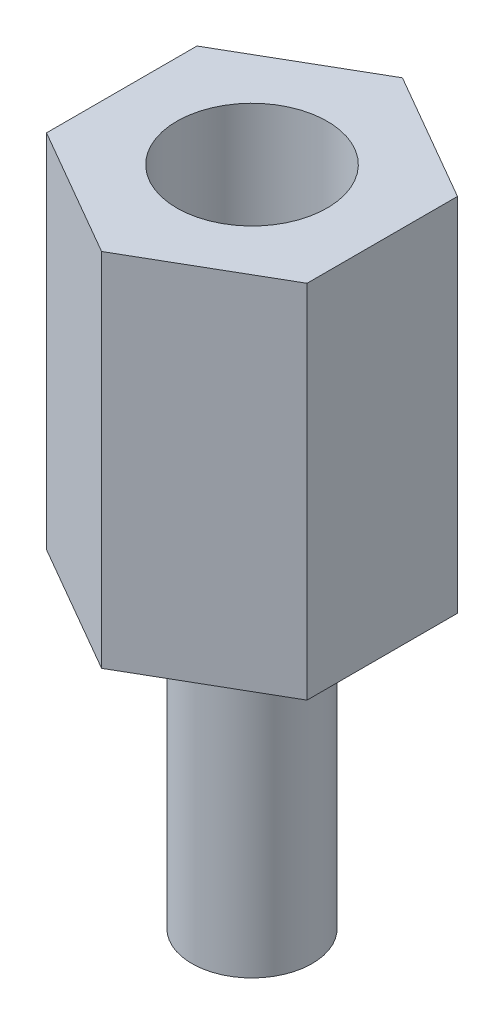
ISO-10303-21;
HEADER;
FILE_DESCRIPTION(('STEP AP214'),'2;1');
FILE_NAME('part.step','',(''),(''),'','','');
FILE_SCHEMA(('AUTOMOTIVE_DESIGN { 1 0 10303 214 1 1 1 1 }'));
ENDSEC;
DATA;
#1=APPLICATION_CONTEXT('core data for automotive mechanical design processes');
#2=APPLICATION_PROTOCOL_DEFINITION('international standard','automotive_design',2000,#1);
#3=PRODUCT_CONTEXT('',#1,'mechanical');
#4=PRODUCT('Part','Part','',(#3));
#5=PRODUCT_RELATED_PRODUCT_CATEGORY('part','',(#4));
#6=PRODUCT_DEFINITION_FORMATION('','',#4);
#7=PRODUCT_DEFINITION_CONTEXT('part definition',#1,'design');
#8=PRODUCT_DEFINITION('design','',#6,#7);
#9=PRODUCT_DEFINITION_SHAPE('','',#8);
#10=(LENGTH_UNIT() NAMED_UNIT(*) SI_UNIT(.MILLI.,.METRE.));
#11=(NAMED_UNIT(*) PLANE_ANGLE_UNIT() SI_UNIT($,.RADIAN.));
#12=(NAMED_UNIT(*) SI_UNIT($,.STERADIAN.) SOLID_ANGLE_UNIT());
#13=UNCERTAINTY_MEASURE_WITH_UNIT(LENGTH_MEASURE(1.E-05),#10,'distance_accuracy_value','');
#14=(GEOMETRIC_REPRESENTATION_CONTEXT(3) GLOBAL_UNCERTAINTY_ASSIGNED_CONTEXT((#13)) GLOBAL_UNIT_ASSIGNED_CONTEXT((#10,
#11,#12)) REPRESENTATION_CONTEXT('',''));
#15=CARTESIAN_POINT('',(0.,0.,0.));
#16=DIRECTION('',(0.,0.,1.));
#17=DIRECTION('',(1.,0.,0.));
#18=AXIS2_PLACEMENT_3D('',#15,#16,#17);
#19=CARTESIAN_POINT('',(0.,5.,0.));
#20=DIRECTION('',(0.,1.,0.));
#21=DIRECTION('',(0.,0.,1.));
#22=AXIS2_PLACEMENT_3D('',#19,#20,#21);
#23=PLANE('',#22);
#24=DIRECTION('',(-0.866025403784442,0.,-0.499999999999995));
#25=VECTOR('',#24,1.);
#26=CARTESIAN_POINT('',(2.16506350946108,5.,-1.25000000000003));
#27=LINE('',#26,#25);
#28=CARTESIAN_POINT('',(2.16506350946108,5.,-1.25000000000003));
#29=VERTEX_POINT('',#28);
#30=CARTESIAN_POINT('',(0.,5.,-2.5));
#31=VERTEX_POINT('',#30);
#32=EDGE_CURVE('E124',#29,#31,#27,.T.);
#33=ORIENTED_EDGE('',*,*,#32,.T.);
#34=DIRECTION('',(-0.866025403784438,0.,0.500000000000001));
#35=VECTOR('',#34,1.);
#36=CARTESIAN_POINT('',(0.,5.,-2.5));
#37=LINE('',#36,#35);
#38=CARTESIAN_POINT('',(-2.1650635094611,5.,-1.25));
#39=VERTEX_POINT('',#38);
#40=EDGE_CURVE('E91',#31,#39,#37,.T.);
#41=ORIENTED_EDGE('',*,*,#40,.T.);
#42=DIRECTION('',(0.,0.,1.));
#43=VECTOR('',#42,1.);
#44=CARTESIAN_POINT('',(-2.1650635094611,5.,-1.25));
#45=LINE('',#44,#43);
#46=CARTESIAN_POINT('',(-2.16506350946109,5.,1.25000000000001));
#47=VERTEX_POINT('',#46);
#48=EDGE_CURVE('E129',#39,#47,#45,.T.);
#49=ORIENTED_EDGE('',*,*,#48,.T.);
#50=DIRECTION('',(0.866025403784441,0.,0.499999999999995));
#51=VECTOR('',#50,1.);
#52=CARTESIAN_POINT('',(-2.16506350946109,5.,1.25000000000001));
#53=LINE('',#52,#51);
#54=CARTESIAN_POINT('',(0.,5.,2.5));
#55=VERTEX_POINT('',#54);
#56=EDGE_CURVE('E131',#47,#55,#53,.T.);
#57=ORIENTED_EDGE('',*,*,#56,.T.);
#58=DIRECTION('',(0.866025403784435,0.,-0.500000000000007));
#59=VECTOR('',#58,1.);
#60=CARTESIAN_POINT('',(0.,5.,2.5));
#61=LINE('',#60,#59);
#62=CARTESIAN_POINT('',(2.16506350946111,5.,1.24999999999998));
#63=VERTEX_POINT('',#62);
#64=EDGE_CURVE('E53',#55,#63,#61,.T.);
#65=ORIENTED_EDGE('',*,*,#64,.T.);
#66=DIRECTION('',(0.,0.,-1.));
#67=VECTOR('',#66,1.);
#68=CARTESIAN_POINT('',(2.16506350946111,5.,1.24999999999998));
#69=LINE('',#68,#67);
#70=EDGE_CURVE('E48',#63,#29,#69,.T.);
#71=ORIENTED_EDGE('',*,*,#70,.T.);
#72=EDGE_LOOP('',(#33,#41,#49,#57,#65,#71));
#73=FACE_BOUND('',#72,.T.);
#74=CARTESIAN_POINT('',(0.,5.,0.));
#75=DIRECTION('',(0.,1.,0.));
#76=DIRECTION('',(0.,0.,1.));
#77=AXIS2_PLACEMENT_3D('',#74,#75,#76);
#78=CIRCLE('',#77,1.25);
#79=CARTESIAN_POINT('',(0.,5.,1.25));
#80=VERTEX_POINT('',#79);
#81=EDGE_CURVE('E121',#80,#80,#78,.T.);
#82=ORIENTED_EDGE('',*,*,#81,.F.);
#83=EDGE_LOOP('',(#82));
#84=FACE_BOUND('',#83,.T.);
#85=ADVANCED_FACE('F32',(#73,#84),#23,.T.);
#86=CARTESIAN_POINT('',(2.16506350946108,5.,-1.25000000000003));
#87=DIRECTION('',(-0.499999999999995,0.,0.866025403784442));
#88=DIRECTION('',(0.866025403784442,0.,0.499999999999995));
#89=AXIS2_PLACEMENT_3D('',#86,#87,#88);
#90=PLANE('',#89);
#91=DIRECTION('',(0.,-1.,0.));
#92=VECTOR('',#91,1.);
#93=CARTESIAN_POINT('',(2.16506350946108,5.,-1.25000000000003));
#94=LINE('',#93,#92);
#95=CARTESIAN_POINT('',(2.16506350946108,-1.,-1.25000000000003));
#96=VERTEX_POINT('',#95);
#97=EDGE_CURVE('E97',#29,#96,#94,.T.);
#98=ORIENTED_EDGE('',*,*,#97,.T.);
#99=DIRECTION('',(0.866025403784442,0.,0.499999999999995));
#100=VECTOR('',#99,1.);
#101=CARTESIAN_POINT('',(0.,-1.,-2.5));
#102=LINE('',#101,#100);
#103=CARTESIAN_POINT('',(0.,-1.,-2.5));
#104=VERTEX_POINT('',#103);
#105=EDGE_CURVE('E96',#104,#96,#102,.T.);
#106=ORIENTED_EDGE('',*,*,#105,.F.);
#107=DIRECTION('',(0.,-1.,0.));
#108=VECTOR('',#107,1.);
#109=CARTESIAN_POINT('',(0.,5.,-2.5));
#110=LINE('',#109,#108);
#111=EDGE_CURVE('E36',#31,#104,#110,.T.);
#112=ORIENTED_EDGE('',*,*,#111,.F.);
#113=ORIENTED_EDGE('',*,*,#32,.F.);
#114=EDGE_LOOP('',(#98,#106,#112,#113));
#115=FACE_BOUND('',#114,.T.);
#116=ADVANCED_FACE('F34',(#115),#90,.F.);
#117=CARTESIAN_POINT('',(0.,5.,-2.5));
#118=DIRECTION('',(0.500000000000001,0.,0.866025403784438));
#119=DIRECTION('',(0.866025403784438,0.,-0.500000000000001));
#120=AXIS2_PLACEMENT_3D('',#117,#118,#119);
#121=PLANE('',#120);
#122=ORIENTED_EDGE('',*,*,#111,.T.);
#123=DIRECTION('',(0.866025403784438,0.,-0.500000000000001));
#124=VECTOR('',#123,1.);
#125=CARTESIAN_POINT('',(-2.1650635094611,-1.,-1.25));
#126=LINE('',#125,#124);
#127=CARTESIAN_POINT('',(-2.1650635094611,-1.,-1.25));
#128=VERTEX_POINT('',#127);
#129=EDGE_CURVE('E90',#128,#104,#126,.T.);
#130=ORIENTED_EDGE('',*,*,#129,.F.);
#131=DIRECTION('',(0.,-1.,0.));
#132=VECTOR('',#131,1.);
#133=CARTESIAN_POINT('',(-2.1650635094611,5.,-1.25));
#134=LINE('',#133,#132);
#135=EDGE_CURVE('E94',#39,#128,#134,.T.);
#136=ORIENTED_EDGE('',*,*,#135,.F.);
#137=ORIENTED_EDGE('',*,*,#40,.F.);
#138=EDGE_LOOP('',(#122,#130,#136,#137));
#139=FACE_BOUND('',#138,.T.);
#140=ADVANCED_FACE('F87',(#139),#121,.F.);
#141=CARTESIAN_POINT('',(-2.1650635094611,5.,-1.25));
#142=DIRECTION('',(1.,0.,0.));
#143=DIRECTION('',(0.,0.,-1.));
#144=AXIS2_PLACEMENT_3D('',#141,#142,#143);
#145=PLANE('',#144);
#146=ORIENTED_EDGE('',*,*,#135,.T.);
#147=DIRECTION('',(0.,0.,-1.));
#148=VECTOR('',#147,1.);
#149=CARTESIAN_POINT('',(-2.16506350946109,-1.,1.25000000000001));
#150=LINE('',#149,#148);
#151=CARTESIAN_POINT('',(-2.16506350946109,-1.,1.25000000000001));
#152=VERTEX_POINT('',#151);
#153=EDGE_CURVE('E107',#152,#128,#150,.T.);
#154=ORIENTED_EDGE('',*,*,#153,.F.);
#155=DIRECTION('',(0.,-1.,0.));
#156=VECTOR('',#155,1.);
#157=CARTESIAN_POINT('',(-2.16506350946109,5.,1.25000000000001));
#158=LINE('',#157,#156);
#159=EDGE_CURVE('E140',#47,#152,#158,.T.);
#160=ORIENTED_EDGE('',*,*,#159,.F.);
#161=ORIENTED_EDGE('',*,*,#48,.F.);
#162=EDGE_LOOP('',(#146,#154,#160,#161));
#163=FACE_BOUND('',#162,.T.);
#164=ADVANCED_FACE('F143',(#163),#145,.F.);
#165=CARTESIAN_POINT('',(-2.16506350946109,5.,1.25000000000001));
#166=DIRECTION('',(0.499999999999995,0.,-0.866025403784442));
#167=DIRECTION('',(-0.866025403784442,0.,-0.499999999999995));
#168=AXIS2_PLACEMENT_3D('',#165,#166,#167);
#169=PLANE('',#168);
#170=ORIENTED_EDGE('',*,*,#159,.T.);
#171=DIRECTION('',(-0.866025403784441,0.,-0.499999999999995));
#172=VECTOR('',#171,1.);
#173=CARTESIAN_POINT('',(0.,-1.,2.5));
#174=LINE('',#173,#172);
#175=CARTESIAN_POINT('',(0.,-1.,2.5));
#176=VERTEX_POINT('',#175);
#177=EDGE_CURVE('E117',#176,#152,#174,.T.);
#178=ORIENTED_EDGE('',*,*,#177,.F.);
#179=DIRECTION('',(0.,-1.,0.));
#180=VECTOR('',#179,1.);
#181=CARTESIAN_POINT('',(0.,5.,2.5));
#182=LINE('',#181,#180);
#183=EDGE_CURVE('E138',#55,#176,#182,.T.);
#184=ORIENTED_EDGE('',*,*,#183,.F.);
#185=ORIENTED_EDGE('',*,*,#56,.F.);
#186=EDGE_LOOP('',(#170,#178,#184,#185));
#187=FACE_BOUND('',#186,.T.);
#188=ADVANCED_FACE('F150',(#187),#169,.F.);
#189=CARTESIAN_POINT('',(0.,5.,2.5));
#190=DIRECTION('',(-0.500000000000007,0.,-0.866025403784435));
#191=DIRECTION('',(-0.866025403784435,0.,0.500000000000007));
#192=AXIS2_PLACEMENT_3D('',#189,#190,#191);
#193=PLANE('',#192);
#194=ORIENTED_EDGE('',*,*,#183,.T.);
#195=DIRECTION('',(-0.866025403784435,0.,0.500000000000007));
#196=VECTOR('',#195,1.);
#197=CARTESIAN_POINT('',(2.16506350946111,-1.,1.24999999999998));
#198=LINE('',#197,#196);
#199=CARTESIAN_POINT('',(2.16506350946111,-1.,1.24999999999998));
#200=VERTEX_POINT('',#199);
#201=EDGE_CURVE('E114',#200,#176,#198,.T.);
#202=ORIENTED_EDGE('',*,*,#201,.F.);
#203=DIRECTION('',(0.,-1.,0.));
#204=VECTOR('',#203,1.);
#205=CARTESIAN_POINT('',(2.16506350946111,5.,1.24999999999998));
#206=LINE('',#205,#204);
#207=EDGE_CURVE('E136',#63,#200,#206,.T.);
#208=ORIENTED_EDGE('',*,*,#207,.F.);
#209=ORIENTED_EDGE('',*,*,#64,.F.);
#210=EDGE_LOOP('',(#194,#202,#208,#209));
#211=FACE_BOUND('',#210,.T.);
#212=ADVANCED_FACE('F153',(#211),#193,.F.);
#213=CARTESIAN_POINT('',(2.16506350946111,5.,1.24999999999998));
#214=DIRECTION('',(-1.,0.,0.));
#215=DIRECTION('',(0.,0.,1.));
#216=AXIS2_PLACEMENT_3D('',#213,#214,#215);
#217=PLANE('',#216);
#218=ORIENTED_EDGE('',*,*,#207,.T.);
#219=DIRECTION('',(0.,0.,1.));
#220=VECTOR('',#219,1.);
#221=CARTESIAN_POINT('',(2.16506350946108,-1.,-1.25000000000003));
#222=LINE('',#221,#220);
#223=EDGE_CURVE('E101',#96,#200,#222,.T.);
#224=ORIENTED_EDGE('',*,*,#223,.F.);
#225=ORIENTED_EDGE('',*,*,#97,.F.);
#226=ORIENTED_EDGE('',*,*,#70,.F.);
#227=EDGE_LOOP('',(#218,#224,#225,#226));
#228=FACE_BOUND('',#227,.T.);
#229=ADVANCED_FACE('F155',(#228),#217,.F.);
#230=CARTESIAN_POINT('',(0.,5.,0.));
#231=DIRECTION('',(0.,-1.,0.));
#232=DIRECTION('',(0.,0.,-1.));
#233=AXIS2_PLACEMENT_3D('',#230,#231,#232);
#234=CYLINDRICAL_SURFACE('',#233,1.25);
#235=ORIENTED_EDGE('',*,*,#81,.T.);
#236=EDGE_LOOP('',(#235));
#237=FACE_BOUND('',#236,.T.);
#238=CARTESIAN_POINT('',(0.,0.,0.));
#239=DIRECTION('',(0.,1.,0.));
#240=DIRECTION('',(0.,0.,1.));
#241=AXIS2_PLACEMENT_3D('',#238,#239,#240);
#242=CIRCLE('',#241,1.25);
#243=CARTESIAN_POINT('',(0.,0.,1.25));
#244=VERTEX_POINT('',#243);
#245=EDGE_CURVE('E120',#244,#244,#242,.T.);
#246=ORIENTED_EDGE('',*,*,#245,.F.);
#247=EDGE_LOOP('',(#246));
#248=FACE_BOUND('',#247,.T.);
#249=ADVANCED_FACE('F157',(#237,#248),#234,.F.);
#250=CARTESIAN_POINT('',(0.,0.,0.));
#251=DIRECTION('',(0.,-1.,0.));
#252=DIRECTION('',(0.,0.,-1.));
#253=AXIS2_PLACEMENT_3D('',#250,#251,#252);
#254=PLANE('',#253);
#255=ORIENTED_EDGE('',*,*,#245,.T.);
#256=EDGE_LOOP('',(#255));
#257=FACE_BOUND('',#256,.T.);
#258=ADVANCED_FACE('F163',(#257),#254,.F.);
#259=CARTESIAN_POINT('',(0.,-1.,0.));
#260=DIRECTION('',(0.,-1.,0.));
#261=DIRECTION('',(0.,0.,-1.));
#262=AXIS2_PLACEMENT_3D('',#259,#260,#261);
#263=PLANE('',#262);
#264=CARTESIAN_POINT('',(0.,-1.,0.));
#265=DIRECTION('',(0.,-1.,0.));
#266=DIRECTION('',(0.,0.,-1.));
#267=AXIS2_PLACEMENT_3D('',#264,#265,#266);
#268=CIRCLE('',#267,1.);
#269=CARTESIAN_POINT('',(0.,-1.,-1.));
#270=VERTEX_POINT('',#269);
#271=EDGE_CURVE('E11',#270,#270,#268,.T.);
#272=ORIENTED_EDGE('',*,*,#271,.F.);
#273=EDGE_LOOP('',(#272));
#274=FACE_BOUND('',#273,.T.);
#275=ORIENTED_EDGE('',*,*,#129,.T.);
#276=ORIENTED_EDGE('',*,*,#105,.T.);
#277=ORIENTED_EDGE('',*,*,#223,.T.);
#278=ORIENTED_EDGE('',*,*,#201,.T.);
#279=ORIENTED_EDGE('',*,*,#177,.T.);
#280=ORIENTED_EDGE('',*,*,#153,.T.);
#281=EDGE_LOOP('',(#275,#276,#277,#278,#279,#280));
#282=FACE_BOUND('',#281,.T.);
#283=ADVANCED_FACE('F104',(#274,#282),#263,.T.);
#284=CARTESIAN_POINT('',(0.,-6.,0.));
#285=DIRECTION('',(0.,1.,0.));
#286=DIRECTION('',(0.,0.,1.));
#287=AXIS2_PLACEMENT_3D('',#284,#285,#286);
#288=CYLINDRICAL_SURFACE('',#287,1.);
#289=CARTESIAN_POINT('',(0.,-6.,0.));
#290=DIRECTION('',(0.,-1.,0.));
#291=DIRECTION('',(0.,0.,-1.));
#292=AXIS2_PLACEMENT_3D('',#289,#290,#291);
#293=CIRCLE('',#292,1.);
#294=CARTESIAN_POINT('',(0.,-6.,-1.));
#295=VERTEX_POINT('',#294);
#296=EDGE_CURVE('E108',#295,#295,#293,.T.);
#297=ORIENTED_EDGE('',*,*,#296,.F.);
#298=EDGE_LOOP('',(#297));
#299=FACE_BOUND('',#298,.T.);
#300=ORIENTED_EDGE('',*,*,#271,.T.);
#301=EDGE_LOOP('',(#300));
#302=FACE_BOUND('',#301,.T.);
#303=ADVANCED_FACE('F178',(#299,#302),#288,.T.);
#304=CARTESIAN_POINT('',(0.,-6.,0.));
#305=DIRECTION('',(0.,-1.,0.));
#306=DIRECTION('',(0.,0.,-1.));
#307=AXIS2_PLACEMENT_3D('',#304,#305,#306);
#308=PLANE('',#307);
#309=ORIENTED_EDGE('',*,*,#296,.T.);
#310=EDGE_LOOP('',(#309));
#311=FACE_BOUND('',#310,.T.);
#312=ADVANCED_FACE('F182',(#311),#308,.T.);
#313=CLOSED_SHELL('',(#85,#116,#140,#164,#188,#212,#229,#249,#258,#283,#303,#312));
#314=MANIFOLD_SOLID_BREP('B2',#313);
#315=ADVANCED_BREP_SHAPE_REPRESENTATION('',(#18,#314),#14);
#316=SHAPE_DEFINITION_REPRESENTATION(#9,#315);
ENDSEC;
END-ISO-10303-21;
